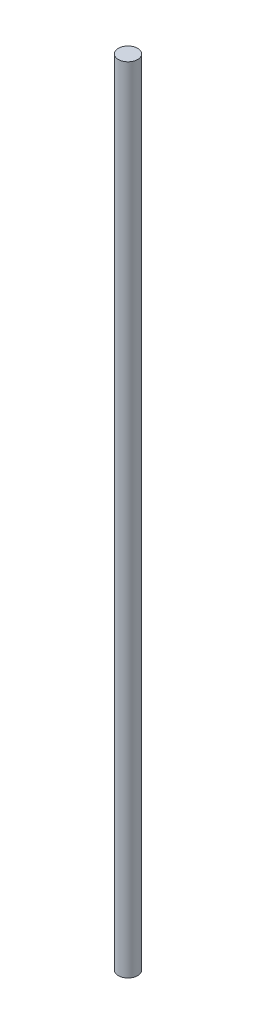
ISO-10303-21;
HEADER;
FILE_DESCRIPTION(('STEP AP214'),'2;1');
FILE_NAME('part.step','',(''),(''),'','','');
FILE_SCHEMA(('AUTOMOTIVE_DESIGN { 1 0 10303 214 1 1 1 1 }'));
ENDSEC;
DATA;
#1=APPLICATION_CONTEXT('core data for automotive mechanical design processes');
#2=APPLICATION_PROTOCOL_DEFINITION('international standard','automotive_design',2000,#1);
#3=PRODUCT_CONTEXT('',#1,'mechanical');
#4=PRODUCT('Part','Part','',(#3));
#5=PRODUCT_RELATED_PRODUCT_CATEGORY('part','',(#4));
#6=PRODUCT_DEFINITION_FORMATION('','',#4);
#7=PRODUCT_DEFINITION_CONTEXT('part definition',#1,'design');
#8=PRODUCT_DEFINITION('design','',#6,#7);
#9=PRODUCT_DEFINITION_SHAPE('','',#8);
#10=(LENGTH_UNIT() NAMED_UNIT(*) SI_UNIT(.MILLI.,.METRE.));
#11=(NAMED_UNIT(*) PLANE_ANGLE_UNIT() SI_UNIT($,.RADIAN.));
#12=(NAMED_UNIT(*) SI_UNIT($,.STERADIAN.) SOLID_ANGLE_UNIT());
#13=UNCERTAINTY_MEASURE_WITH_UNIT(LENGTH_MEASURE(1.E-05),#10,'distance_accuracy_value','');
#14=(GEOMETRIC_REPRESENTATION_CONTEXT(3) GLOBAL_UNCERTAINTY_ASSIGNED_CONTEXT((#13)) GLOBAL_UNIT_ASSIGNED_CONTEXT((#10,
#11,#12)) REPRESENTATION_CONTEXT('',''));
#15=CARTESIAN_POINT('',(0.,0.,0.));
#16=DIRECTION('',(0.,0.,1.));
#17=DIRECTION('',(1.,0.,0.));
#18=AXIS2_PLACEMENT_3D('',#15,#16,#17);
#19=CARTESIAN_POINT('',(0.,260.35,0.));
#20=DIRECTION('',(0.,-1.,0.));
#21=DIRECTION('',(0.,0.,-1.));
#22=AXIS2_PLACEMENT_3D('',#19,#20,#21);
#23=CYLINDRICAL_SURFACE('',#22,3.175);
#24=CARTESIAN_POINT('',(0.,260.35,0.));
#25=DIRECTION('',(0.,1.,0.));
#26=DIRECTION('',(0.,0.,1.));
#27=AXIS2_PLACEMENT_3D('',#24,#25,#26);
#28=CIRCLE('',#27,3.175);
#29=CARTESIAN_POINT('',(0.,260.35,3.175));
#30=VERTEX_POINT('',#29);
#31=EDGE_CURVE('E10',#30,#30,#28,.T.);
#32=ORIENTED_EDGE('',*,*,#31,.F.);
#33=EDGE_LOOP('',(#32));
#34=FACE_BOUND('',#33,.T.);
#35=CARTESIAN_POINT('',(0.,0.,0.));
#36=DIRECTION('',(0.,1.,0.));
#37=DIRECTION('',(0.,0.,1.));
#38=AXIS2_PLACEMENT_3D('',#35,#36,#37);
#39=CIRCLE('',#38,3.175);
#40=CARTESIAN_POINT('',(0.,0.,3.175));
#41=VERTEX_POINT('',#40);
#42=EDGE_CURVE('E33',#41,#41,#39,.T.);
#43=ORIENTED_EDGE('',*,*,#42,.T.);
#44=EDGE_LOOP('',(#43));
#45=FACE_BOUND('',#44,.T.);
#46=ADVANCED_FACE('F30',(#34,#45),#23,.T.);
#47=CARTESIAN_POINT('',(0.,260.35,0.));
#48=DIRECTION('',(0.,1.,0.));
#49=DIRECTION('',(0.,0.,1.));
#50=AXIS2_PLACEMENT_3D('',#47,#48,#49);
#51=PLANE('',#50);
#52=ORIENTED_EDGE('',*,*,#31,.T.);
#53=EDGE_LOOP('',(#52));
#54=FACE_BOUND('',#53,.T.);
#55=ADVANCED_FACE('F45',(#54),#51,.T.);
#56=CARTESIAN_POINT('',(0.,0.,0.));
#57=DIRECTION('',(0.,1.,0.));
#58=DIRECTION('',(0.,0.,1.));
#59=AXIS2_PLACEMENT_3D('',#56,#57,#58);
#60=PLANE('',#59);
#61=ORIENTED_EDGE('',*,*,#42,.F.);
#62=EDGE_LOOP('',(#61));
#63=FACE_BOUND('',#62,.T.);
#64=ADVANCED_FACE('F43',(#63),#60,.F.);
#65=CLOSED_SHELL('',(#46,#55,#64));
#66=MANIFOLD_SOLID_BREP('B2',#65);
#67=ADVANCED_BREP_SHAPE_REPRESENTATION('',(#18,#66),#14);
#68=SHAPE_DEFINITION_REPRESENTATION(#9,#67);
ENDSEC;
END-ISO-10303-21;
